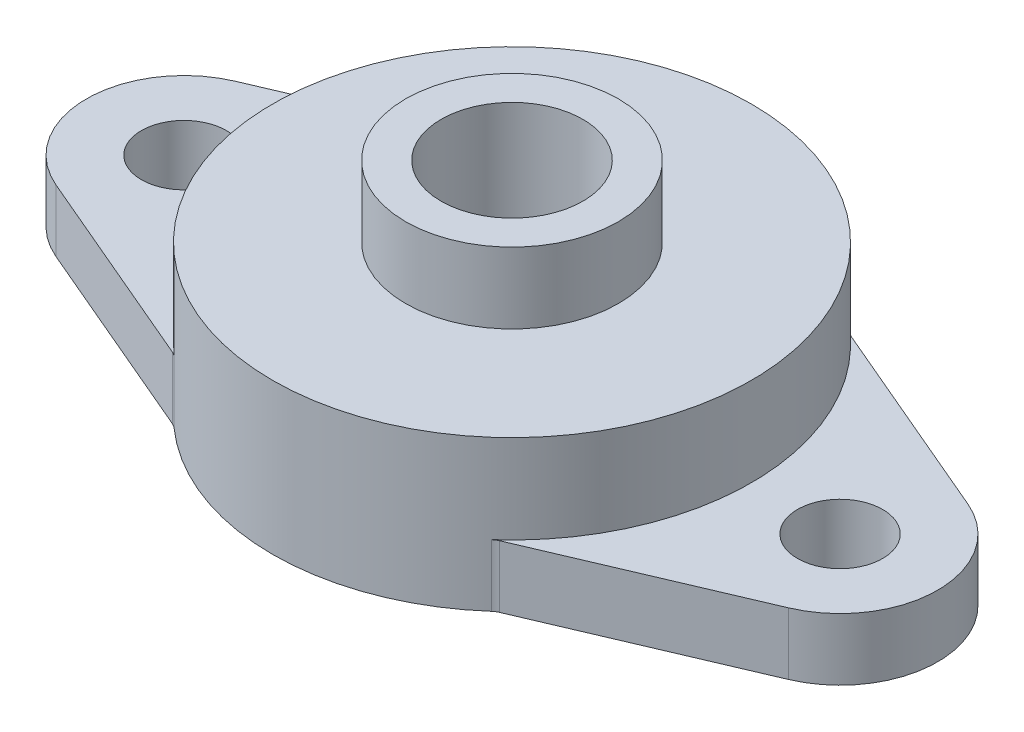
ISO-10303-21;
HEADER;
FILE_DESCRIPTION(('STEP AP214'),'2;1');
FILE_NAME('part.step','',(''),(''),'','','');
FILE_SCHEMA(('AUTOMOTIVE_DESIGN { 1 0 10303 214 1 1 1 1 }'));
ENDSEC;
DATA;
#1=APPLICATION_CONTEXT('core data for automotive mechanical design processes');
#2=APPLICATION_PROTOCOL_DEFINITION('international standard','automotive_design',2000,#1);
#3=PRODUCT_CONTEXT('',#1,'mechanical');
#4=PRODUCT('Part','Part','',(#3));
#5=PRODUCT_RELATED_PRODUCT_CATEGORY('part','',(#4));
#6=PRODUCT_DEFINITION_FORMATION('','',#4);
#7=PRODUCT_DEFINITION_CONTEXT('part definition',#1,'design');
#8=PRODUCT_DEFINITION('design','',#6,#7);
#9=PRODUCT_DEFINITION_SHAPE('','',#8);
#10=(LENGTH_UNIT() NAMED_UNIT(*) SI_UNIT(.MILLI.,.METRE.));
#11=(NAMED_UNIT(*) PLANE_ANGLE_UNIT() SI_UNIT($,.RADIAN.));
#12=(NAMED_UNIT(*) SI_UNIT($,.STERADIAN.) SOLID_ANGLE_UNIT());
#13=UNCERTAINTY_MEASURE_WITH_UNIT(LENGTH_MEASURE(1.E-05),#10,'distance_accuracy_value','');
#14=(GEOMETRIC_REPRESENTATION_CONTEXT(3) GLOBAL_UNCERTAINTY_ASSIGNED_CONTEXT((#13)) GLOBAL_UNIT_ASSIGNED_CONTEXT((#10,
#11,#12)) REPRESENTATION_CONTEXT('',''));
#15=CARTESIAN_POINT('',(0.,0.,0.));
#16=DIRECTION('',(0.,0.,1.));
#17=DIRECTION('',(1.,0.,0.));
#18=AXIS2_PLACEMENT_3D('',#15,#16,#17);
#19=CARTESIAN_POINT('',(9.61341335715331,3.5,10.8550579742582));
#20=DIRECTION('',(0.,1.,0.));
#21=DIRECTION('',(0.,0.,1.));
#22=AXIS2_PLACEMENT_3D('',#19,#20,#21);
#23=PLANE('',#22);
#24=CARTESIAN_POINT('',(18.5,3.5,0.));
#25=DIRECTION('',(0.,1.,0.));
#26=DIRECTION('',(0.,0.,1.));
#27=AXIS2_PLACEMENT_3D('',#24,#25,#26);
#28=CIRCLE('',#27,2.4);
#29=CARTESIAN_POINT('',(18.5,3.5,2.39999999999999));
#30=VERTEX_POINT('',#29);
#31=EDGE_CURVE('E249',#30,#30,#28,.T.);
#32=ORIENTED_EDGE('',*,*,#31,.F.);
#33=EDGE_LOOP('',(#32));
#34=FACE_BOUND('',#33,.T.);
#35=CARTESIAN_POINT('',(0.,3.5,0.));
#36=DIRECTION('',(0.,1.,0.));
#37=DIRECTION('',(0.,0.,1.));
#38=AXIS2_PLACEMENT_3D('',#35,#36,#37);
#39=CIRCLE('',#38,13.5);
#40=CARTESIAN_POINT('',(8.95041933252205,3.5,10.1064332863783));
#41=VERTEX_POINT('',#40);
#42=CARTESIAN_POINT('',(8.95041933252204,3.5,-10.1064332863783));
#43=VERTEX_POINT('',#42);
#44=EDGE_CURVE('E207',#41,#43,#39,.T.);
#45=ORIENTED_EDGE('',*,*,#44,.F.);
#46=CARTESIAN_POINT('',(9.61341335715331,3.5,10.8550579742582));
#47=DIRECTION('',(0.,-1.,0.));
#48=DIRECTION('',(0.,0.,1.));
#49=AXIS2_PLACEMENT_3D('',#46,#47,#48);
#50=CIRCLE('',#49,1.);
#51=CARTESIAN_POINT('',(9.22121105396399,3.5,9.93517898581841));
#52=VERTEX_POINT('',#51);
#53=EDGE_CURVE('E183',#41,#52,#50,.T.);
#54=ORIENTED_EDGE('',*,*,#53,.T.);
#55=DIRECTION('',(0.919878988439784,0.,-0.39220230318931));
#56=VECTOR('',#55,1.);
#57=CARTESIAN_POINT('',(20.6571126675412,3.5,5.05933443641881));
#58=LINE('',#57,#56);
#59=CARTESIAN_POINT('',(20.6571126675412,3.5,5.05933443641881));
#60=VERTEX_POINT('',#59);
#61=EDGE_CURVE('E109',#52,#60,#58,.T.);
#62=ORIENTED_EDGE('',*,*,#61,.T.);
#63=CARTESIAN_POINT('',(18.5,3.5,0.));
#64=DIRECTION('',(0.,1.,0.));
#65=DIRECTION('',(0.,0.,1.));
#66=AXIS2_PLACEMENT_3D('',#63,#64,#65);
#67=CIRCLE('',#66,5.5);
#68=CARTESIAN_POINT('',(20.6571126675412,3.5,-5.05933443641882));
#69=VERTEX_POINT('',#68);
#70=EDGE_CURVE('E274',#60,#69,#67,.T.);
#71=ORIENTED_EDGE('',*,*,#70,.T.);
#72=DIRECTION('',(-0.919878988439784,0.,-0.392202303189311));
#73=VECTOR('',#72,1.);
#74=CARTESIAN_POINT('',(20.6571126675412,3.5,-5.05933443641881));
#75=LINE('',#74,#73);
#76=CARTESIAN_POINT('',(9.22121105396399,3.5,-9.93517898581842));
#77=VERTEX_POINT('',#76);
#78=EDGE_CURVE('E229',#69,#77,#75,.T.);
#79=ORIENTED_EDGE('',*,*,#78,.T.);
#80=CARTESIAN_POINT('',(9.6134133571533,3.5,-10.8550579742582));
#81=DIRECTION('',(0.,-1.,0.));
#82=DIRECTION('',(0.,0.,-1.));
#83=AXIS2_PLACEMENT_3D('',#80,#81,#82);
#84=CIRCLE('',#83,0.999999999999999);
#85=EDGE_CURVE('E225',#77,#43,#84,.T.);
#86=ORIENTED_EDGE('',*,*,#85,.T.);
#87=EDGE_LOOP('',(#45,#54,#62,#71,#79,#86));
#88=FACE_BOUND('',#87,.T.);
#89=ADVANCED_FACE('F33',(#34,#88),#23,.T.);
#90=CARTESIAN_POINT('',(9.61341335715331,3.5,10.8550579742582));
#91=DIRECTION('',(0.,-1.,0.));
#92=DIRECTION('',(0.,0.,-1.));
#93=AXIS2_PLACEMENT_3D('',#90,#91,#92);
#94=CYLINDRICAL_SURFACE('',#93,1.);
#95=CARTESIAN_POINT('',(9.61341335715331,0.,10.8550579742582));
#96=DIRECTION('',(0.,-1.,0.));
#97=DIRECTION('',(0.,0.,1.));
#98=AXIS2_PLACEMENT_3D('',#95,#96,#97);
#99=CIRCLE('',#98,1.);
#100=CARTESIAN_POINT('',(8.95041933252204,0.,10.1064332863783));
#101=VERTEX_POINT('',#100);
#102=CARTESIAN_POINT('',(9.22121105396399,0.,9.93517898581841));
#103=VERTEX_POINT('',#102);
#104=EDGE_CURVE('E160',#101,#103,#99,.T.);
#105=ORIENTED_EDGE('',*,*,#104,.T.);
#106=DIRECTION('',(0.,-1.,0.));
#107=VECTOR('',#106,1.);
#108=CARTESIAN_POINT('',(9.22121105396399,3.5,9.93517898581841));
#109=LINE('',#108,#107);
#110=EDGE_CURVE('E43',#52,#103,#109,.T.);
#111=ORIENTED_EDGE('',*,*,#110,.F.);
#112=ORIENTED_EDGE('',*,*,#53,.F.);
#113=DIRECTION('',(0.,-1.,0.));
#114=VECTOR('',#113,1.);
#115=CARTESIAN_POINT('',(8.95041933252204,3.5,10.1064332863783));
#116=LINE('',#115,#114);
#117=EDGE_CURVE('E156',#41,#101,#116,.T.);
#118=ORIENTED_EDGE('',*,*,#117,.T.);
#119=EDGE_LOOP('',(#105,#111,#112,#118));
#120=FACE_BOUND('',#119,.T.);
#121=ADVANCED_FACE('F35',(#120),#94,.F.);
#122=CARTESIAN_POINT('',(20.6571126675412,3.5,5.05933443641881));
#123=DIRECTION('',(-0.39220230318931,0.,-0.919878988439784));
#124=DIRECTION('',(-0.919878988439784,0.,0.392202303189311));
#125=AXIS2_PLACEMENT_3D('',#122,#123,#124);
#126=PLANE('',#125);
#127=DIRECTION('',(0.919878988439784,0.,-0.39220230318931));
#128=VECTOR('',#127,1.);
#129=CARTESIAN_POINT('',(20.6571126675412,0.,5.05933443641881));
#130=LINE('',#129,#128);
#131=CARTESIAN_POINT('',(20.6571126675412,0.,5.05933443641881));
#132=VERTEX_POINT('',#131);
#133=EDGE_CURVE('E163',#103,#132,#130,.T.);
#134=ORIENTED_EDGE('',*,*,#133,.T.);
#135=DIRECTION('',(0.,-1.,0.));
#136=VECTOR('',#135,1.);
#137=CARTESIAN_POINT('',(20.6571126675412,3.5,5.05933443641881));
#138=LINE('',#137,#136);
#139=EDGE_CURVE('E198',#60,#132,#138,.T.);
#140=ORIENTED_EDGE('',*,*,#139,.F.);
#141=ORIENTED_EDGE('',*,*,#61,.F.);
#142=ORIENTED_EDGE('',*,*,#110,.T.);
#143=EDGE_LOOP('',(#134,#140,#141,#142));
#144=FACE_BOUND('',#143,.T.);
#145=ADVANCED_FACE('F297',(#144),#126,.F.);
#146=CARTESIAN_POINT('',(18.5,3.5,0.));
#147=DIRECTION('',(0.,-1.,0.));
#148=DIRECTION('',(0.,0.,-1.));
#149=AXIS2_PLACEMENT_3D('',#146,#147,#148);
#150=CYLINDRICAL_SURFACE('',#149,5.5);
#151=CARTESIAN_POINT('',(18.5,0.,0.));
#152=DIRECTION('',(0.,1.,0.));
#153=DIRECTION('',(0.,0.,1.));
#154=AXIS2_PLACEMENT_3D('',#151,#152,#153);
#155=CIRCLE('',#154,5.5);
#156=CARTESIAN_POINT('',(20.6571126675412,0.,-5.05933443641882));
#157=VERTEX_POINT('',#156);
#158=EDGE_CURVE('E166',#132,#157,#155,.T.);
#159=ORIENTED_EDGE('',*,*,#158,.T.);
#160=DIRECTION('',(0.,-1.,0.));
#161=VECTOR('',#160,1.);
#162=CARTESIAN_POINT('',(20.6571126675412,3.5,-5.05933443641882));
#163=LINE('',#162,#161);
#164=EDGE_CURVE('E194',#69,#157,#163,.T.);
#165=ORIENTED_EDGE('',*,*,#164,.F.);
#166=ORIENTED_EDGE('',*,*,#70,.F.);
#167=ORIENTED_EDGE('',*,*,#139,.T.);
#168=EDGE_LOOP('',(#159,#165,#166,#167));
#169=FACE_BOUND('',#168,.T.);
#170=ADVANCED_FACE('F299',(#169),#150,.T.);
#171=CARTESIAN_POINT('',(20.6571126675412,3.5,-5.05933443641881));
#172=DIRECTION('',(-0.392202303189311,0.,0.919878988439784));
#173=DIRECTION('',(0.919878988439784,0.,0.392202303189311));
#174=AXIS2_PLACEMENT_3D('',#171,#172,#173);
#175=PLANE('',#174);
#176=DIRECTION('',(-0.919878988439784,0.,-0.392202303189311));
#177=VECTOR('',#176,1.);
#178=CARTESIAN_POINT('',(20.6571126675412,0.,-5.05933443641881));
#179=LINE('',#178,#177);
#180=CARTESIAN_POINT('',(9.22121105396399,0.,-9.93517898581842));
#181=VERTEX_POINT('',#180);
#182=EDGE_CURVE('E168',#157,#181,#179,.T.);
#183=ORIENTED_EDGE('',*,*,#182,.T.);
#184=DIRECTION('',(0.,-1.,0.));
#185=VECTOR('',#184,1.);
#186=CARTESIAN_POINT('',(9.22121105396399,3.5,-9.93517898581842));
#187=LINE('',#186,#185);
#188=EDGE_CURVE('E191',#77,#181,#187,.T.);
#189=ORIENTED_EDGE('',*,*,#188,.F.);
#190=ORIENTED_EDGE('',*,*,#78,.F.);
#191=ORIENTED_EDGE('',*,*,#164,.T.);
#192=EDGE_LOOP('',(#183,#189,#190,#191));
#193=FACE_BOUND('',#192,.T.);
#194=ADVANCED_FACE('F282',(#193),#175,.F.);
#195=CARTESIAN_POINT('',(9.6134133571533,3.5,-10.8550579742582));
#196=DIRECTION('',(0.,-1.,0.));
#197=DIRECTION('',(0.,0.,-1.));
#198=AXIS2_PLACEMENT_3D('',#195,#196,#197);
#199=CYLINDRICAL_SURFACE('',#198,0.999999999999999);
#200=CARTESIAN_POINT('',(9.6134133571533,0.,-10.8550579742582));
#201=DIRECTION('',(0.,-1.,0.));
#202=DIRECTION('',(0.,0.,-1.));
#203=AXIS2_PLACEMENT_3D('',#200,#201,#202);
#204=CIRCLE('',#203,0.999999999999999);
#205=CARTESIAN_POINT('',(8.95041933252204,0.,-10.1064332863783));
#206=VERTEX_POINT('',#205);
#207=EDGE_CURVE('E170',#181,#206,#204,.T.);
#208=ORIENTED_EDGE('',*,*,#207,.T.);
#209=DIRECTION('',(0.,-1.,0.));
#210=VECTOR('',#209,1.);
#211=CARTESIAN_POINT('',(8.95041933252204,3.5,-10.1064332863783));
#212=LINE('',#211,#210);
#213=EDGE_CURVE('E195',#43,#206,#212,.T.);
#214=ORIENTED_EDGE('',*,*,#213,.F.);
#215=ORIENTED_EDGE('',*,*,#85,.F.);
#216=ORIENTED_EDGE('',*,*,#188,.T.);
#217=EDGE_LOOP('',(#208,#214,#215,#216));
#218=FACE_BOUND('',#217,.T.);
#219=ADVANCED_FACE('F286',(#218),#199,.F.);
#220=CARTESIAN_POINT('',(-9.6134133571533,3.5,-10.8550579742582));
#221=DIRECTION('',(0.,-1.,0.));
#222=DIRECTION('',(0.,0.,-1.));
#223=AXIS2_PLACEMENT_3D('',#220,#221,#222);
#224=CYLINDRICAL_SURFACE('',#223,0.999999999999999);
#225=CARTESIAN_POINT('',(-9.6134133571533,0.,-10.8550579742582));
#226=DIRECTION('',(0.,-1.,0.));
#227=DIRECTION('',(0.,0.,1.));
#228=AXIS2_PLACEMENT_3D('',#225,#226,#227);
#229=CIRCLE('',#228,0.999999999999999);
#230=CARTESIAN_POINT('',(-8.95041933252203,0.,-10.1064332863783));
#231=VERTEX_POINT('',#230);
#232=CARTESIAN_POINT('',(-9.22121105396399,0.,-9.93517898581842));
#233=VERTEX_POINT('',#232);
#234=EDGE_CURVE('E174',#231,#233,#229,.T.);
#235=ORIENTED_EDGE('',*,*,#234,.T.);
#236=DIRECTION('',(0.,-1.,0.));
#237=VECTOR('',#236,1.);
#238=CARTESIAN_POINT('',(-9.22121105396399,3.5,-9.93517898581842));
#239=LINE('',#238,#237);
#240=CARTESIAN_POINT('',(-9.22121105396399,3.5,-9.93517898581842));
#241=VERTEX_POINT('',#240);
#242=EDGE_CURVE('E187',#241,#233,#239,.T.);
#243=ORIENTED_EDGE('',*,*,#242,.F.);
#244=CARTESIAN_POINT('',(-9.6134133571533,3.5,-10.8550579742582));
#245=DIRECTION('',(0.,-1.,0.));
#246=DIRECTION('',(0.,0.,1.));
#247=AXIS2_PLACEMENT_3D('',#244,#245,#246);
#248=CIRCLE('',#247,0.999999999999999);
#249=CARTESIAN_POINT('',(-8.95041933252203,3.5,-10.1064332863783));
#250=VERTEX_POINT('',#249);
#251=EDGE_CURVE('E223',#250,#241,#248,.T.);
#252=ORIENTED_EDGE('',*,*,#251,.F.);
#253=DIRECTION('',(0.,-1.,0.));
#254=VECTOR('',#253,1.);
#255=CARTESIAN_POINT('',(-8.95041933252203,3.5,-10.1064332863783));
#256=LINE('',#255,#254);
#257=EDGE_CURVE('E190',#250,#231,#256,.T.);
#258=ORIENTED_EDGE('',*,*,#257,.T.);
#259=EDGE_LOOP('',(#235,#243,#252,#258));
#260=FACE_BOUND('',#259,.T.);
#261=ADVANCED_FACE('F295',(#260),#224,.F.);
#262=CARTESIAN_POINT('',(-20.6571126675412,3.5,-5.05933443641881));
#263=DIRECTION('',(0.392202303189311,0.,0.919878988439784));
#264=DIRECTION('',(0.919878988439784,0.,-0.392202303189311));
#265=AXIS2_PLACEMENT_3D('',#262,#263,#264);
#266=PLANE('',#265);
#267=DIRECTION('',(-0.919878988439784,0.,0.392202303189311));
#268=VECTOR('',#267,1.);
#269=CARTESIAN_POINT('',(-20.6571126675412,0.,-5.05933443641881));
#270=LINE('',#269,#268);
#271=CARTESIAN_POINT('',(-20.6571126675412,0.,-5.05933443641881));
#272=VERTEX_POINT('',#271);
#273=EDGE_CURVE('E176',#233,#272,#270,.T.);
#274=ORIENTED_EDGE('',*,*,#273,.T.);
#275=DIRECTION('',(0.,-1.,0.));
#276=VECTOR('',#275,1.);
#277=CARTESIAN_POINT('',(-20.6571126675412,3.5,-5.05933443641881));
#278=LINE('',#277,#276);
#279=CARTESIAN_POINT('',(-20.6571126675412,3.5,-5.05933443641881));
#280=VERTEX_POINT('',#279);
#281=EDGE_CURVE('E151',#280,#272,#278,.T.);
#282=ORIENTED_EDGE('',*,*,#281,.F.);
#283=DIRECTION('',(-0.919878988439784,0.,0.392202303189311));
#284=VECTOR('',#283,1.);
#285=CARTESIAN_POINT('',(-20.6571126675412,3.5,-5.05933443641881));
#286=LINE('',#285,#284);
#287=EDGE_CURVE('E139',#241,#280,#286,.T.);
#288=ORIENTED_EDGE('',*,*,#287,.F.);
#289=ORIENTED_EDGE('',*,*,#242,.T.);
#290=EDGE_LOOP('',(#274,#282,#288,#289));
#291=FACE_BOUND('',#290,.T.);
#292=ADVANCED_FACE('F333',(#291),#266,.F.);
#293=CARTESIAN_POINT('',(-18.5,3.5,0.));
#294=DIRECTION('',(0.,-1.,0.));
#295=DIRECTION('',(0.,0.,-1.));
#296=AXIS2_PLACEMENT_3D('',#293,#294,#295);
#297=CYLINDRICAL_SURFACE('',#296,5.5);
#298=CARTESIAN_POINT('',(-18.5,0.,0.));
#299=DIRECTION('',(0.,1.,0.));
#300=DIRECTION('',(0.,0.,1.));
#301=AXIS2_PLACEMENT_3D('',#298,#299,#300);
#302=CIRCLE('',#301,5.5);
#303=CARTESIAN_POINT('',(-20.6571126675412,0.,5.05933443641881));
#304=VERTEX_POINT('',#303);
#305=EDGE_CURVE('E148',#272,#304,#302,.T.);
#306=ORIENTED_EDGE('',*,*,#305,.T.);
#307=DIRECTION('',(0.,-1.,0.));
#308=VECTOR('',#307,1.);
#309=CARTESIAN_POINT('',(-20.6571126675412,3.5,5.05933443641881));
#310=LINE('',#309,#308);
#311=CARTESIAN_POINT('',(-20.6571126675412,3.5,5.05933443641881));
#312=VERTEX_POINT('',#311);
#313=EDGE_CURVE('E145',#312,#304,#310,.T.);
#314=ORIENTED_EDGE('',*,*,#313,.F.);
#315=CARTESIAN_POINT('',(-18.5,3.5,0.));
#316=DIRECTION('',(0.,1.,0.));
#317=DIRECTION('',(0.,0.,1.));
#318=AXIS2_PLACEMENT_3D('',#315,#316,#317);
#319=CIRCLE('',#318,5.5);
#320=EDGE_CURVE('E132',#280,#312,#319,.T.);
#321=ORIENTED_EDGE('',*,*,#320,.F.);
#322=ORIENTED_EDGE('',*,*,#281,.T.);
#323=EDGE_LOOP('',(#306,#314,#321,#322));
#324=FACE_BOUND('',#323,.T.);
#325=ADVANCED_FACE('F146',(#324),#297,.T.);
#326=CARTESIAN_POINT('',(-20.6571126675412,3.5,5.05933443641881));
#327=DIRECTION('',(0.392202303189311,0.,-0.919878988439784));
#328=DIRECTION('',(-0.919878988439784,0.,-0.392202303189311));
#329=AXIS2_PLACEMENT_3D('',#326,#327,#328);
#330=PLANE('',#329);
#331=DIRECTION('',(0.919878988439784,0.,0.392202303189311));
#332=VECTOR('',#331,1.);
#333=CARTESIAN_POINT('',(-20.6571126675412,0.,5.05933443641881));
#334=LINE('',#333,#332);
#335=CARTESIAN_POINT('',(-9.22121105396399,0.,9.93517898581842));
#336=VERTEX_POINT('',#335);
#337=EDGE_CURVE('E179',#304,#336,#334,.T.);
#338=ORIENTED_EDGE('',*,*,#337,.T.);
#339=DIRECTION('',(0.,-1.,0.));
#340=VECTOR('',#339,1.);
#341=CARTESIAN_POINT('',(-9.22121105396399,3.5,9.93517898581842));
#342=LINE('',#341,#340);
#343=CARTESIAN_POINT('',(-9.22121105396399,3.5,9.93517898581842));
#344=VERTEX_POINT('',#343);
#345=EDGE_CURVE('E152',#344,#336,#342,.T.);
#346=ORIENTED_EDGE('',*,*,#345,.F.);
#347=DIRECTION('',(0.919878988439784,0.,0.392202303189311));
#348=VECTOR('',#347,1.);
#349=CARTESIAN_POINT('',(-20.6571126675412,3.5,5.05933443641881));
#350=LINE('',#349,#348);
#351=EDGE_CURVE('E136',#312,#344,#350,.T.);
#352=ORIENTED_EDGE('',*,*,#351,.F.);
#353=ORIENTED_EDGE('',*,*,#313,.T.);
#354=EDGE_LOOP('',(#338,#346,#352,#353));
#355=FACE_BOUND('',#354,.T.);
#356=ADVANCED_FACE('F154',(#355),#330,.F.);
#357=CARTESIAN_POINT('',(-9.6134133571533,3.5,10.8550579742582));
#358=DIRECTION('',(0.,-1.,0.));
#359=DIRECTION('',(0.,0.,-1.));
#360=AXIS2_PLACEMENT_3D('',#357,#358,#359);
#361=CYLINDRICAL_SURFACE('',#360,0.999999999999999);
#362=CARTESIAN_POINT('',(-9.6134133571533,0.,10.8550579742582));
#363=DIRECTION('',(0.,-1.,0.));
#364=DIRECTION('',(0.,0.,-1.));
#365=AXIS2_PLACEMENT_3D('',#362,#363,#364);
#366=CIRCLE('',#365,0.999999999999999);
#367=CARTESIAN_POINT('',(-8.95041933252204,0.,10.1064332863783));
#368=VERTEX_POINT('',#367);
#369=EDGE_CURVE('E93',#336,#368,#366,.T.);
#370=ORIENTED_EDGE('',*,*,#369,.T.);
#371=DIRECTION('',(0.,-1.,0.));
#372=VECTOR('',#371,1.);
#373=CARTESIAN_POINT('',(-8.95041933252204,3.5,10.1064332863783));
#374=LINE('',#373,#372);
#375=CARTESIAN_POINT('',(-8.95041933252204,3.5,10.1064332863783));
#376=VERTEX_POINT('',#375);
#377=EDGE_CURVE('E184',#376,#368,#374,.T.);
#378=ORIENTED_EDGE('',*,*,#377,.F.);
#379=CARTESIAN_POINT('',(-9.6134133571533,3.5,10.8550579742582));
#380=DIRECTION('',(0.,-1.,0.));
#381=DIRECTION('',(0.,0.,-1.));
#382=AXIS2_PLACEMENT_3D('',#379,#380,#381);
#383=CIRCLE('',#382,0.999999999999999);
#384=EDGE_CURVE('E52',#344,#376,#383,.T.);
#385=ORIENTED_EDGE('',*,*,#384,.F.);
#386=ORIENTED_EDGE('',*,*,#345,.T.);
#387=EDGE_LOOP('',(#370,#378,#385,#386));
#388=FACE_BOUND('',#387,.T.);
#389=ADVANCED_FACE('F322',(#388),#361,.F.);
#390=CARTESIAN_POINT('',(0.,3.5,0.));
#391=DIRECTION('',(0.,-1.,0.));
#392=DIRECTION('',(0.,0.,-1.));
#393=AXIS2_PLACEMENT_3D('',#390,#391,#392);
#394=CYLINDRICAL_SURFACE('',#393,13.5);
#395=CARTESIAN_POINT('',(0.,0.,0.));
#396=DIRECTION('',(0.,1.,0.));
#397=DIRECTION('',(0.,0.,1.));
#398=AXIS2_PLACEMENT_3D('',#395,#396,#397);
#399=CIRCLE('',#398,13.5);
#400=EDGE_CURVE('E100',#368,#101,#399,.T.);
#401=ORIENTED_EDGE('',*,*,#400,.T.);
#402=ORIENTED_EDGE('',*,*,#117,.F.);
#403=ORIENTED_EDGE('',*,*,#44,.T.);
#404=ORIENTED_EDGE('',*,*,#213,.T.);
#405=CARTESIAN_POINT('',(0.,0.,0.));
#406=DIRECTION('',(0.,1.,0.));
#407=DIRECTION('',(0.,0.,1.));
#408=AXIS2_PLACEMENT_3D('',#405,#406,#407);
#409=CIRCLE('',#408,13.5);
#410=EDGE_CURVE('E172',#206,#231,#409,.T.);
#411=ORIENTED_EDGE('',*,*,#410,.T.);
#412=ORIENTED_EDGE('',*,*,#257,.F.);
#413=EDGE_CURVE('E11',#250,#376,#39,.T.);
#414=ORIENTED_EDGE('',*,*,#413,.T.);
#415=ORIENTED_EDGE('',*,*,#377,.T.);
#416=EDGE_LOOP('',(#401,#402,#403,#404,#411,#412,#414,#415));
#417=FACE_BOUND('',#416,.T.);
#418=CARTESIAN_POINT('',(0.,8.5,0.));
#419=DIRECTION('',(0.,1.,0.));
#420=DIRECTION('',(0.,0.,1.));
#421=AXIS2_PLACEMENT_3D('',#418,#419,#420);
#422=CIRCLE('',#421,13.5);
#423=CARTESIAN_POINT('',(0.,8.5,13.5));
#424=VERTEX_POINT('',#423);
#425=EDGE_CURVE('E164',#424,#424,#422,.T.);
#426=ORIENTED_EDGE('',*,*,#425,.F.);
#427=EDGE_LOOP('',(#426));
#428=FACE_BOUND('',#427,.T.);
#429=ADVANCED_FACE('F264',(#417,#428),#394,.T.);
#430=CARTESIAN_POINT('',(-18.5,3.5,0.));
#431=DIRECTION('',(0.,1.,0.));
#432=DIRECTION('',(0.,0.,1.));
#433=AXIS2_PLACEMENT_3D('',#430,#431,#432);
#434=CIRCLE('',#433,2.4);
#435=CARTESIAN_POINT('',(-18.5,3.5,2.4));
#436=VERTEX_POINT('',#435);
#437=EDGE_CURVE('E238',#436,#436,#434,.T.);
#438=ORIENTED_EDGE('',*,*,#437,.F.);
#439=EDGE_LOOP('',(#438));
#440=FACE_BOUND('',#439,.T.);
#441=ORIENTED_EDGE('',*,*,#413,.F.);
#442=ORIENTED_EDGE('',*,*,#251,.T.);
#443=ORIENTED_EDGE('',*,*,#287,.T.);
#444=ORIENTED_EDGE('',*,*,#320,.T.);
#445=ORIENTED_EDGE('',*,*,#351,.T.);
#446=ORIENTED_EDGE('',*,*,#384,.T.);
#447=EDGE_LOOP('',(#441,#442,#443,#444,#445,#446));
#448=FACE_BOUND('',#447,.T.);
#449=ADVANCED_FACE('F134',(#440,#448),#23,.T.);
#450=CARTESIAN_POINT('',(9.61341335715331,0.,10.8550579742582));
#451=DIRECTION('',(0.,1.,0.));
#452=DIRECTION('',(0.,0.,1.));
#453=AXIS2_PLACEMENT_3D('',#450,#451,#452);
#454=PLANE('',#453);
#455=CARTESIAN_POINT('',(18.5,0.,0.));
#456=DIRECTION('',(0.,1.,0.));
#457=DIRECTION('',(0.,0.,1.));
#458=AXIS2_PLACEMENT_3D('',#455,#456,#457);
#459=CIRCLE('',#458,2.4);
#460=CARTESIAN_POINT('',(18.5,0.,2.39999999999999));
#461=VERTEX_POINT('',#460);
#462=EDGE_CURVE('E37',#461,#461,#459,.T.);
#463=ORIENTED_EDGE('',*,*,#462,.T.);
#464=EDGE_LOOP('',(#463));
#465=FACE_BOUND('',#464,.T.);
#466=CARTESIAN_POINT('',(-18.5,0.,0.));
#467=DIRECTION('',(0.,1.,0.));
#468=DIRECTION('',(0.,0.,1.));
#469=AXIS2_PLACEMENT_3D('',#466,#467,#468);
#470=CIRCLE('',#469,2.4);
#471=CARTESIAN_POINT('',(-18.5,0.,2.4));
#472=VERTEX_POINT('',#471);
#473=EDGE_CURVE('E235',#472,#472,#470,.T.);
#474=ORIENTED_EDGE('',*,*,#473,.T.);
#475=EDGE_LOOP('',(#474));
#476=FACE_BOUND('',#475,.T.);
#477=CARTESIAN_POINT('',(0.,0.,0.));
#478=DIRECTION('',(0.,1.,0.));
#479=DIRECTION('',(0.,0.,1.));
#480=AXIS2_PLACEMENT_3D('',#477,#478,#479);
#481=CIRCLE('',#480,4.);
#482=CARTESIAN_POINT('',(0.,0.,4.));
#483=VERTEX_POINT('',#482);
#484=EDGE_CURVE('E242',#483,#483,#481,.T.);
#485=ORIENTED_EDGE('',*,*,#484,.T.);
#486=EDGE_LOOP('',(#485));
#487=FACE_BOUND('',#486,.T.);
#488=ORIENTED_EDGE('',*,*,#104,.F.);
#489=ORIENTED_EDGE('',*,*,#400,.F.);
#490=ORIENTED_EDGE('',*,*,#369,.F.);
#491=ORIENTED_EDGE('',*,*,#337,.F.);
#492=ORIENTED_EDGE('',*,*,#305,.F.);
#493=ORIENTED_EDGE('',*,*,#273,.F.);
#494=ORIENTED_EDGE('',*,*,#234,.F.);
#495=ORIENTED_EDGE('',*,*,#410,.F.);
#496=ORIENTED_EDGE('',*,*,#207,.F.);
#497=ORIENTED_EDGE('',*,*,#182,.F.);
#498=ORIENTED_EDGE('',*,*,#158,.F.);
#499=ORIENTED_EDGE('',*,*,#133,.F.);
#500=EDGE_LOOP('',(#488,#489,#490,#491,#492,#493,#494,#495,#496,#497,#498,#499));
#501=FACE_BOUND('',#500,.T.);
#502=ADVANCED_FACE('F288',(#465,#476,#487,#501),#454,.F.);
#503=CARTESIAN_POINT('',(0.,8.5,0.));
#504=DIRECTION('',(0.,1.,0.));
#505=DIRECTION('',(0.,0.,1.));
#506=AXIS2_PLACEMENT_3D('',#503,#504,#505);
#507=PLANE('',#506);
#508=CARTESIAN_POINT('',(0.,8.5,0.));
#509=DIRECTION('',(0.,1.,0.));
#510=DIRECTION('',(0.,0.,1.));
#511=AXIS2_PLACEMENT_3D('',#508,#509,#510);
#512=CIRCLE('',#511,6.);
#513=CARTESIAN_POINT('',(0.,8.5,6.));
#514=VERTEX_POINT('',#513);
#515=EDGE_CURVE('E254',#514,#514,#512,.T.);
#516=ORIENTED_EDGE('',*,*,#515,.F.);
#517=EDGE_LOOP('',(#516));
#518=FACE_BOUND('',#517,.T.);
#519=ORIENTED_EDGE('',*,*,#425,.T.);
#520=EDGE_LOOP('',(#519));
#521=FACE_BOUND('',#520,.T.);
#522=ADVANCED_FACE('F320',(#518,#521),#507,.T.);
#523=CARTESIAN_POINT('',(0.,12.5,0.));
#524=DIRECTION('',(0.,-1.,0.));
#525=DIRECTION('',(0.,0.,-1.));
#526=AXIS2_PLACEMENT_3D('',#523,#524,#525);
#527=CYLINDRICAL_SURFACE('',#526,6.);
#528=CARTESIAN_POINT('',(0.,12.5,0.));
#529=DIRECTION('',(0.,1.,0.));
#530=DIRECTION('',(0.,0.,1.));
#531=AXIS2_PLACEMENT_3D('',#528,#529,#530);
#532=CIRCLE('',#531,6.);
#533=CARTESIAN_POINT('',(0.,12.5,6.));
#534=VERTEX_POINT('',#533);
#535=EDGE_CURVE('E255',#534,#534,#532,.T.);
#536=ORIENTED_EDGE('',*,*,#535,.F.);
#537=EDGE_LOOP('',(#536));
#538=FACE_BOUND('',#537,.T.);
#539=ORIENTED_EDGE('',*,*,#515,.T.);
#540=EDGE_LOOP('',(#539));
#541=FACE_BOUND('',#540,.T.);
#542=ADVANCED_FACE('F386',(#538,#541),#527,.T.);
#543=CARTESIAN_POINT('',(0.,12.5,0.));
#544=DIRECTION('',(0.,1.,0.));
#545=DIRECTION('',(0.,0.,1.));
#546=AXIS2_PLACEMENT_3D('',#543,#544,#545);
#547=PLANE('',#546);
#548=CARTESIAN_POINT('',(0.,12.5,0.));
#549=DIRECTION('',(0.,1.,0.));
#550=DIRECTION('',(0.,0.,1.));
#551=AXIS2_PLACEMENT_3D('',#548,#549,#550);
#552=CIRCLE('',#551,4.);
#553=CARTESIAN_POINT('',(0.,12.5,4.));
#554=VERTEX_POINT('',#553);
#555=EDGE_CURVE('E237',#554,#554,#552,.T.);
#556=ORIENTED_EDGE('',*,*,#555,.F.);
#557=EDGE_LOOP('',(#556));
#558=FACE_BOUND('',#557,.T.);
#559=ORIENTED_EDGE('',*,*,#535,.T.);
#560=EDGE_LOOP('',(#559));
#561=FACE_BOUND('',#560,.T.);
#562=ADVANCED_FACE('F395',(#558,#561),#547,.T.);
#563=CARTESIAN_POINT('',(0.,-2.50000000007189E-05,0.));
#564=DIRECTION('',(0.,1.,0.));
#565=DIRECTION('',(0.,0.,1.));
#566=AXIS2_PLACEMENT_3D('',#563,#564,#565);
#567=CYLINDRICAL_SURFACE('',#566,4.);
#568=ORIENTED_EDGE('',*,*,#555,.T.);
#569=EDGE_LOOP('',(#568));
#570=FACE_BOUND('',#569,.T.);
#571=ORIENTED_EDGE('',*,*,#484,.F.);
#572=EDGE_LOOP('',(#571));
#573=FACE_BOUND('',#572,.T.);
#574=ADVANCED_FACE('F405',(#570,#573),#567,.F.);
#575=CARTESIAN_POINT('',(-18.5,-2.49999999998515E-05,0.));
#576=DIRECTION('',(0.,1.,0.));
#577=DIRECTION('',(0.,0.,1.));
#578=AXIS2_PLACEMENT_3D('',#575,#576,#577);
#579=CYLINDRICAL_SURFACE('',#578,2.4);
#580=ORIENTED_EDGE('',*,*,#437,.T.);
#581=EDGE_LOOP('',(#580));
#582=FACE_BOUND('',#581,.T.);
#583=ORIENTED_EDGE('',*,*,#473,.F.);
#584=EDGE_LOOP('',(#583));
#585=FACE_BOUND('',#584,.T.);
#586=ADVANCED_FACE('F414',(#582,#585),#579,.F.);
#587=CARTESIAN_POINT('',(18.5,-2.49999999998515E-05,0.));
#588=DIRECTION('',(0.,1.,0.));
#589=DIRECTION('',(0.,0.,1.));
#590=AXIS2_PLACEMENT_3D('',#587,#588,#589);
#591=CYLINDRICAL_SURFACE('',#590,2.4);
#592=ORIENTED_EDGE('',*,*,#31,.T.);
#593=EDGE_LOOP('',(#592));
#594=FACE_BOUND('',#593,.T.);
#595=ORIENTED_EDGE('',*,*,#462,.F.);
#596=EDGE_LOOP('',(#595));
#597=FACE_BOUND('',#596,.T.);
#598=ADVANCED_FACE('F439',(#594,#597),#591,.F.);
#599=CLOSED_SHELL('',(#89,#121,#145,#170,#194,#219,#261,#292,#325,#356,#389,#429,#449,#502,#522,
#542,#562,#574,#586,#598));
#600=MANIFOLD_SOLID_BREP('B2',#599);
#601=ADVANCED_BREP_SHAPE_REPRESENTATION('',(#18,#600),#14);
#602=SHAPE_DEFINITION_REPRESENTATION(#9,#601);
ENDSEC;
END-ISO-10303-21;
